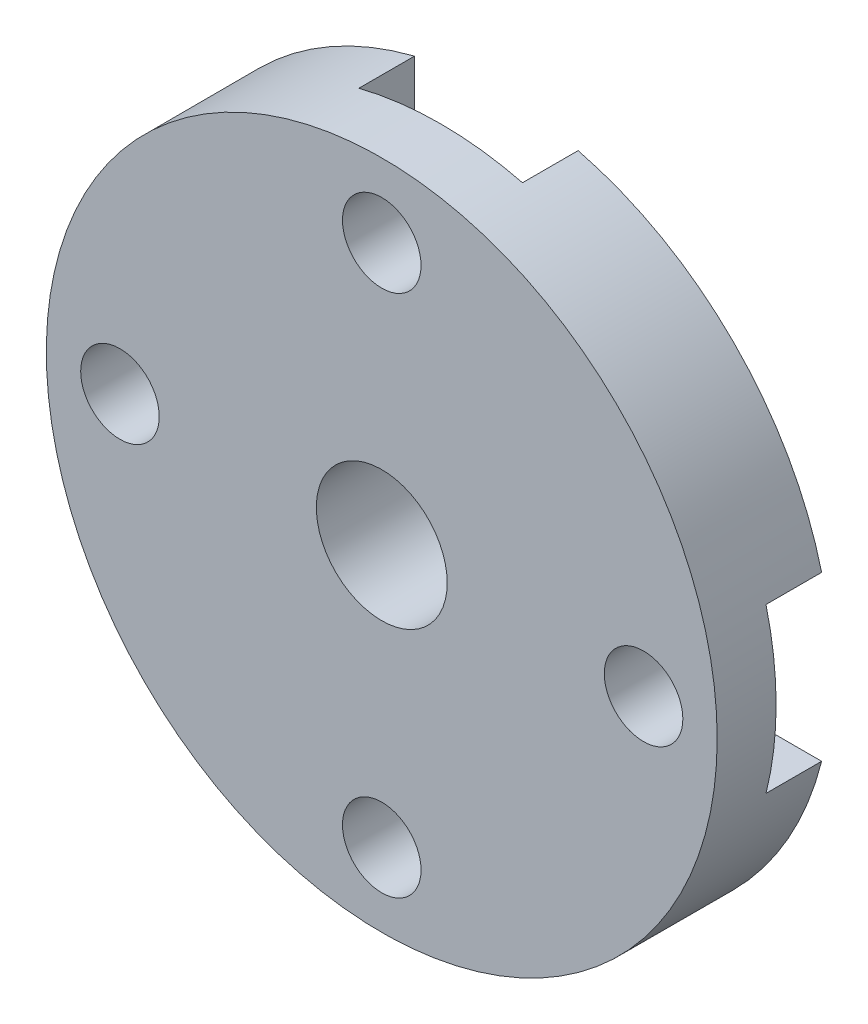
ISO-10303-21;
HEADER;
FILE_DESCRIPTION(('STEP AP214'),'2;1');
FILE_NAME('part.step','',(''),(''),'','','');
FILE_SCHEMA(('AUTOMOTIVE_DESIGN { 1 0 10303 214 1 1 1 1 }'));
ENDSEC;
DATA;
#1=APPLICATION_CONTEXT('core data for automotive mechanical design processes');
#2=APPLICATION_PROTOCOL_DEFINITION('international standard','automotive_design',2000,#1);
#3=PRODUCT_CONTEXT('',#1,'mechanical');
#4=PRODUCT('Part','Part','',(#3));
#5=PRODUCT_RELATED_PRODUCT_CATEGORY('part','',(#4));
#6=PRODUCT_DEFINITION_FORMATION('','',#4);
#7=PRODUCT_DEFINITION_CONTEXT('part definition',#1,'design');
#8=PRODUCT_DEFINITION('design','',#6,#7);
#9=PRODUCT_DEFINITION_SHAPE('','',#8);
#10=(LENGTH_UNIT() NAMED_UNIT(*) SI_UNIT(.MILLI.,.METRE.));
#11=(NAMED_UNIT(*) PLANE_ANGLE_UNIT() SI_UNIT($,.RADIAN.));
#12=(NAMED_UNIT(*) SI_UNIT($,.STERADIAN.) SOLID_ANGLE_UNIT());
#13=UNCERTAINTY_MEASURE_WITH_UNIT(LENGTH_MEASURE(1.E-05),#10,'distance_accuracy_value','');
#14=(GEOMETRIC_REPRESENTATION_CONTEXT(3) GLOBAL_UNCERTAINTY_ASSIGNED_CONTEXT((#13)) GLOBAL_UNIT_ASSIGNED_CONTEXT((#10,
#11,#12)) REPRESENTATION_CONTEXT('',''));
#15=CARTESIAN_POINT('',(0.,0.,0.));
#16=DIRECTION('',(0.,0.,1.));
#17=DIRECTION('',(1.,0.,0.));
#18=AXIS2_PLACEMENT_3D('',#15,#16,#17);
#19=CARTESIAN_POINT('',(0.,8.,3.5));
#20=DIRECTION('',(0.,0.,-1.));
#21=DIRECTION('',(-1.,0.,0.));
#22=AXIS2_PLACEMENT_3D('',#19,#20,#21);
#23=CYLINDRICAL_SURFACE('',#22,1.2);
#24=CARTESIAN_POINT('',(0.,8.,3.5));
#25=DIRECTION('',(0.,0.,1.));
#26=DIRECTION('',(1.,0.,0.));
#27=AXIS2_PLACEMENT_3D('',#24,#25,#26);
#28=CIRCLE('',#27,1.2);
#29=CARTESIAN_POINT('',(1.2,8.,3.5));
#30=VERTEX_POINT('',#29);
#31=EDGE_CURVE('E315',#30,#30,#28,.T.);
#32=ORIENTED_EDGE('',*,*,#31,.T.);
#33=EDGE_LOOP('',(#32));
#34=FACE_BOUND('',#33,.T.);
#35=CARTESIAN_POINT('',(0.,8.,1.7));
#36=DIRECTION('',(0.,0.,-1.));
#37=DIRECTION('',(-1.,0.,0.));
#38=AXIS2_PLACEMENT_3D('',#35,#36,#37);
#39=CIRCLE('',#38,1.2);
#40=CARTESIAN_POINT('',(-1.2,8.,1.7));
#41=VERTEX_POINT('',#40);
#42=EDGE_CURVE('E214',#41,#41,#39,.F.);
#43=ORIENTED_EDGE('',*,*,#42,.F.);
#44=EDGE_LOOP('',(#43));
#45=FACE_BOUND('',#44,.T.);
#46=ADVANCED_FACE('F47',(#34,#45),#23,.F.);
#47=CARTESIAN_POINT('',(8.,0.,3.5));
#48=DIRECTION('',(0.,0.,-1.));
#49=DIRECTION('',(-1.,0.,0.));
#50=AXIS2_PLACEMENT_3D('',#47,#48,#49);
#51=CYLINDRICAL_SURFACE('',#50,1.2);
#52=CARTESIAN_POINT('',(8.,0.,3.5));
#53=DIRECTION('',(0.,0.,1.));
#54=DIRECTION('',(1.,0.,0.));
#55=AXIS2_PLACEMENT_3D('',#52,#53,#54);
#56=CIRCLE('',#55,1.2);
#57=CARTESIAN_POINT('',(9.2,0.,3.5));
#58=VERTEX_POINT('',#57);
#59=EDGE_CURVE('E311',#58,#58,#56,.T.);
#60=ORIENTED_EDGE('',*,*,#59,.T.);
#61=EDGE_LOOP('',(#60));
#62=FACE_BOUND('',#61,.T.);
#63=CARTESIAN_POINT('',(8.,0.,1.7));
#64=DIRECTION('',(0.,0.,-1.));
#65=DIRECTION('',(-1.,0.,0.));
#66=AXIS2_PLACEMENT_3D('',#63,#64,#65);
#67=CIRCLE('',#66,1.2);
#68=CARTESIAN_POINT('',(6.8,0.,1.7));
#69=VERTEX_POINT('',#68);
#70=EDGE_CURVE('E239',#69,#69,#67,.F.);
#71=ORIENTED_EDGE('',*,*,#70,.F.);
#72=EDGE_LOOP('',(#71));
#73=FACE_BOUND('',#72,.T.);
#74=ADVANCED_FACE('F435',(#62,#73),#51,.F.);
#75=CARTESIAN_POINT('',(0.,-8.,3.5));
#76=DIRECTION('',(0.,0.,-1.));
#77=DIRECTION('',(-1.,0.,0.));
#78=AXIS2_PLACEMENT_3D('',#75,#76,#77);
#79=CYLINDRICAL_SURFACE('',#78,1.2);
#80=CARTESIAN_POINT('',(0.,-8.,3.5));
#81=DIRECTION('',(0.,0.,1.));
#82=DIRECTION('',(1.,0.,0.));
#83=AXIS2_PLACEMENT_3D('',#80,#81,#82);
#84=CIRCLE('',#83,1.2);
#85=CARTESIAN_POINT('',(1.19999999999994,-8.,3.5));
#86=VERTEX_POINT('',#85);
#87=EDGE_CURVE('E306',#86,#86,#84,.T.);
#88=ORIENTED_EDGE('',*,*,#87,.T.);
#89=EDGE_LOOP('',(#88));
#90=FACE_BOUND('',#89,.T.);
#91=CARTESIAN_POINT('',(0.,-8.,1.7));
#92=DIRECTION('',(0.,0.,-1.));
#93=DIRECTION('',(-1.,0.,0.));
#94=AXIS2_PLACEMENT_3D('',#91,#92,#93);
#95=CIRCLE('',#94,1.2);
#96=CARTESIAN_POINT('',(-1.20000000000006,-8.,1.7));
#97=VERTEX_POINT('',#96);
#98=EDGE_CURVE('E195',#97,#97,#95,.F.);
#99=ORIENTED_EDGE('',*,*,#98,.F.);
#100=EDGE_LOOP('',(#99));
#101=FACE_BOUND('',#100,.T.);
#102=ADVANCED_FACE('F442',(#90,#101),#79,.F.);
#103=CARTESIAN_POINT('',(-8.,0.,3.5));
#104=DIRECTION('',(0.,0.,-1.));
#105=DIRECTION('',(-1.,0.,0.));
#106=AXIS2_PLACEMENT_3D('',#103,#104,#105);
#107=CYLINDRICAL_SURFACE('',#106,1.2);
#108=CARTESIAN_POINT('',(-8.,0.,3.5));
#109=DIRECTION('',(0.,0.,1.));
#110=DIRECTION('',(1.,0.,0.));
#111=AXIS2_PLACEMENT_3D('',#108,#109,#110);
#112=CIRCLE('',#111,1.2);
#113=CARTESIAN_POINT('',(-6.8,0.,3.5));
#114=VERTEX_POINT('',#113);
#115=EDGE_CURVE('E302',#114,#114,#112,.T.);
#116=ORIENTED_EDGE('',*,*,#115,.T.);
#117=EDGE_LOOP('',(#116));
#118=FACE_BOUND('',#117,.T.);
#119=CARTESIAN_POINT('',(-8.,0.,1.7));
#120=DIRECTION('',(0.,0.,-1.));
#121=DIRECTION('',(-1.,0.,0.));
#122=AXIS2_PLACEMENT_3D('',#119,#120,#121);
#123=CIRCLE('',#122,1.2);
#124=CARTESIAN_POINT('',(-9.2,0.,1.7));
#125=VERTEX_POINT('',#124);
#126=EDGE_CURVE('E167',#125,#125,#123,.F.);
#127=ORIENTED_EDGE('',*,*,#126,.F.);
#128=EDGE_LOOP('',(#127));
#129=FACE_BOUND('',#128,.T.);
#130=ADVANCED_FACE('F49',(#118,#129),#107,.F.);
#131=CARTESIAN_POINT('',(0.,0.,3.5));
#132=DIRECTION('',(0.,0.,-1.));
#133=DIRECTION('',(-1.,0.,0.));
#134=AXIS2_PLACEMENT_3D('',#131,#132,#133);
#135=CYLINDRICAL_SURFACE('',#134,10.25);
#136=CARTESIAN_POINT('',(0.,0.,3.5));
#137=DIRECTION('',(0.,0.,1.));
#138=DIRECTION('',(1.,0.,0.));
#139=AXIS2_PLACEMENT_3D('',#136,#137,#138);
#140=CIRCLE('',#139,10.25);
#141=CARTESIAN_POINT('',(10.25,0.,3.5));
#142=VERTEX_POINT('',#141);
#143=EDGE_CURVE('E323',#142,#142,#140,.T.);
#144=ORIENTED_EDGE('',*,*,#143,.F.);
#145=EDGE_LOOP('',(#144));
#146=FACE_BOUND('',#145,.T.);
#147=DIRECTION('',(0.,0.,-1.));
#148=VECTOR('',#147,1.);
#149=CARTESIAN_POINT('',(-2.50099999999994,-9.94019612482572,1.7));
#150=LINE('',#149,#148);
#151=CARTESIAN_POINT('',(-2.50099999999994,-9.94019612482572,1.7));
#152=VERTEX_POINT('',#151);
#153=CARTESIAN_POINT('',(-2.50099999999994,-9.94019612482572,0.));
#154=VERTEX_POINT('',#153);
#155=EDGE_CURVE('E260',#152,#154,#150,.T.);
#156=ORIENTED_EDGE('',*,*,#155,.F.);
#157=CARTESIAN_POINT('',(0.,0.,1.7));
#158=DIRECTION('',(0.,0.,-1.));
#159=DIRECTION('',(-1.,0.,0.));
#160=AXIS2_PLACEMENT_3D('',#157,#158,#159);
#161=CIRCLE('',#160,10.25);
#162=CARTESIAN_POINT('',(2.49800000000006,-9.94095045757697,1.7));
#163=VERTEX_POINT('',#162);
#164=EDGE_CURVE('E207',#163,#152,#161,.T.);
#165=ORIENTED_EDGE('',*,*,#164,.F.);
#166=DIRECTION('',(0.,0.,-1.));
#167=VECTOR('',#166,1.);
#168=CARTESIAN_POINT('',(2.49800000000006,-9.94095045757697,1.7));
#169=LINE('',#168,#167);
#170=CARTESIAN_POINT('',(2.49800000000006,-9.94095045757697,0.));
#171=VERTEX_POINT('',#170);
#172=EDGE_CURVE('E263',#163,#171,#169,.T.);
#173=ORIENTED_EDGE('',*,*,#172,.T.);
#174=CARTESIAN_POINT('',(0.,0.,0.));
#175=DIRECTION('',(0.,0.,1.));
#176=DIRECTION('',(1.,0.,0.));
#177=AXIS2_PLACEMENT_3D('',#174,#175,#176);
#178=CIRCLE('',#177,10.25);
#179=CARTESIAN_POINT('',(9.94069912028324,-2.49900000000003,0.));
#180=VERTEX_POINT('',#179);
#181=EDGE_CURVE('E331',#171,#180,#178,.T.);
#182=ORIENTED_EDGE('',*,*,#181,.T.);
#183=DIRECTION('',(0.,0.,-1.));
#184=VECTOR('',#183,1.);
#185=CARTESIAN_POINT('',(9.94069912028324,-2.49900000000003,1.7));
#186=LINE('',#185,#184);
#187=CARTESIAN_POINT('',(9.94069912028324,-2.49900000000003,1.7));
#188=VERTEX_POINT('',#187);
#189=EDGE_CURVE('E298',#188,#180,#186,.T.);
#190=ORIENTED_EDGE('',*,*,#189,.F.);
#191=CARTESIAN_POINT('',(0.,0.,1.7));
#192=DIRECTION('',(0.,0.,-1.));
#193=DIRECTION('',(-1.,0.,0.));
#194=AXIS2_PLACEMENT_3D('',#191,#192,#193);
#195=CIRCLE('',#194,10.25);
#196=CARTESIAN_POINT('',(9.94069932139572,2.49899920000038,1.7));
#197=VERTEX_POINT('',#196);
#198=EDGE_CURVE('E283',#197,#188,#195,.T.);
#199=ORIENTED_EDGE('',*,*,#198,.F.);
#200=DIRECTION('',(0.,0.,-1.));
#201=VECTOR('',#200,1.);
#202=CARTESIAN_POINT('',(9.94069932139572,2.49899920000038,1.7));
#203=LINE('',#202,#201);
#204=CARTESIAN_POINT('',(9.94069932139573,2.49899920000038,0.));
#205=VERTEX_POINT('',#204);
#206=EDGE_CURVE('E294',#197,#205,#203,.T.);
#207=ORIENTED_EDGE('',*,*,#206,.T.);
#208=CARTESIAN_POINT('',(2.5,9.94044767603552,0.));
#209=VERTEX_POINT('',#208);
#210=EDGE_CURVE('E307',#205,#209,#178,.T.);
#211=ORIENTED_EDGE('',*,*,#210,.T.);
#212=DIRECTION('',(0.,0.,-1.));
#213=VECTOR('',#212,1.);
#214=CARTESIAN_POINT('',(2.5,9.94044767603552,1.7));
#215=LINE('',#214,#213);
#216=CARTESIAN_POINT('',(2.5,9.94044767603552,1.7));
#217=VERTEX_POINT('',#216);
#218=EDGE_CURVE('E240',#217,#209,#215,.T.);
#219=ORIENTED_EDGE('',*,*,#218,.F.);
#220=CARTESIAN_POINT('',(0.,0.,1.7));
#221=DIRECTION('',(0.,0.,-1.));
#222=DIRECTION('',(-1.,0.,0.));
#223=AXIS2_PLACEMENT_3D('',#220,#221,#222);
#224=CIRCLE('',#223,10.25);
#225=CARTESIAN_POINT('',(-2.5,9.94044767603552,1.7));
#226=VERTEX_POINT('',#225);
#227=EDGE_CURVE('E227',#226,#217,#224,.T.);
#228=ORIENTED_EDGE('',*,*,#227,.F.);
#229=DIRECTION('',(0.,0.,-1.));
#230=VECTOR('',#229,1.);
#231=CARTESIAN_POINT('',(-2.5,9.94044767603552,1.7));
#232=LINE('',#231,#230);
#233=CARTESIAN_POINT('',(-2.5,9.94044767603552,0.));
#234=VERTEX_POINT('',#233);
#235=EDGE_CURVE('E243',#226,#234,#232,.T.);
#236=ORIENTED_EDGE('',*,*,#235,.T.);
#237=CARTESIAN_POINT('',(-9.94019612482571,2.50099999999997,0.));
#238=VERTEX_POINT('',#237);
#239=EDGE_CURVE('E335',#234,#238,#178,.T.);
#240=ORIENTED_EDGE('',*,*,#239,.T.);
#241=DIRECTION('',(0.,0.,-1.));
#242=VECTOR('',#241,1.);
#243=CARTESIAN_POINT('',(-9.94019612482571,2.50099999999997,1.7));
#244=LINE('',#243,#242);
#245=CARTESIAN_POINT('',(-9.94019612482571,2.50099999999997,1.7));
#246=VERTEX_POINT('',#245);
#247=EDGE_CURVE('E219',#246,#238,#244,.T.);
#248=ORIENTED_EDGE('',*,*,#247,.F.);
#249=CARTESIAN_POINT('',(0.,0.,1.7));
#250=DIRECTION('',(0.,0.,-1.));
#251=DIRECTION('',(-1.,0.,0.));
#252=AXIS2_PLACEMENT_3D('',#249,#250,#251);
#253=CIRCLE('',#252,10.25);
#254=CARTESIAN_POINT('',(-9.94069912028324,-2.49900000000003,1.7));
#255=VERTEX_POINT('',#254);
#256=EDGE_CURVE('E176',#255,#246,#253,.T.);
#257=ORIENTED_EDGE('',*,*,#256,.F.);
#258=DIRECTION('',(0.,0.,-1.));
#259=VECTOR('',#258,1.);
#260=CARTESIAN_POINT('',(-9.94069912028324,-2.49900000000003,1.7));
#261=LINE('',#260,#259);
#262=CARTESIAN_POINT('',(-9.94069912028324,-2.49900000000003,0.));
#263=VERTEX_POINT('',#262);
#264=EDGE_CURVE('E249',#255,#263,#261,.T.);
#265=ORIENTED_EDGE('',*,*,#264,.T.);
#266=EDGE_CURVE('E336',#263,#154,#178,.T.);
#267=ORIENTED_EDGE('',*,*,#266,.T.);
#268=EDGE_LOOP('',(#156,#165,#173,#182,#190,#199,#207,#211,#219,#228,#236,#240,#248,#257,#265,#267));
#269=FACE_BOUND('',#268,.T.);
#270=ADVANCED_FACE('F390',(#146,#269),#135,.T.);
#271=CARTESIAN_POINT('',(0.,0.,0.));
#272=DIRECTION('',(0.,0.,1.));
#273=DIRECTION('',(1.,0.,0.));
#274=AXIS2_PLACEMENT_3D('',#271,#272,#273);
#275=PLANE('',#274);
#276=CARTESIAN_POINT('',(0.,0.,0.));
#277=DIRECTION('',(0.,0.,1.));
#278=DIRECTION('',(1.,0.,0.));
#279=AXIS2_PLACEMENT_3D('',#276,#277,#278);
#280=CIRCLE('',#279,2.);
#281=CARTESIAN_POINT('',(2.,0.,0.));
#282=VERTEX_POINT('',#281);
#283=EDGE_CURVE('E301',#282,#282,#280,.T.);
#284=ORIENTED_EDGE('',*,*,#283,.T.);
#285=EDGE_LOOP('',(#284));
#286=FACE_BOUND('',#285,.T.);
#287=DIRECTION('',(0.,1.,0.));
#288=VECTOR('',#287,1.);
#289=CARTESIAN_POINT('',(-2.50099999999994,0.,0.));
#290=LINE('',#289,#288);
#291=CARTESIAN_POINT('',(-2.50100020015988,-8.07068945608362,0.));
#292=VERTEX_POINT('',#291);
#293=EDGE_CURVE('E11',#154,#292,#290,.T.);
#294=ORIENTED_EDGE('',*,*,#293,.F.);
#295=ORIENTED_EDGE('',*,*,#266,.F.);
#296=DIRECTION('',(1.,0.,0.));
#297=VECTOR('',#296,1.);
#298=CARTESIAN_POINT('',(0.,-2.49900000000003,0.));
#299=LINE('',#298,#297);
#300=CARTESIAN_POINT('',(-8.001,-2.49900000000003,0.));
#301=VERTEX_POINT('',#300);
#302=EDGE_CURVE('E362',#263,#301,#299,.T.);
#303=ORIENTED_EDGE('',*,*,#302,.T.);
#304=CARTESIAN_POINT('',(-8.001,0.000999999999972068,0.));
#305=DIRECTION('',(0.,0.,-1.));
#306=DIRECTION('',(-1.,0.,0.));
#307=AXIS2_PLACEMENT_3D('',#304,#305,#306);
#308=CIRCLE('',#307,2.5);
#309=CARTESIAN_POINT('',(-8.001,2.50099999999997,0.));
#310=VERTEX_POINT('',#309);
#311=EDGE_CURVE('E356',#301,#310,#308,.F.);
#312=ORIENTED_EDGE('',*,*,#311,.T.);
#313=DIRECTION('',(1.,0.,0.));
#314=VECTOR('',#313,1.);
#315=CARTESIAN_POINT('',(0.,2.50099999999997,0.));
#316=LINE('',#315,#314);
#317=EDGE_CURVE('E161',#238,#310,#316,.T.);
#318=ORIENTED_EDGE('',*,*,#317,.F.);
#319=ORIENTED_EDGE('',*,*,#239,.F.);
#320=DIRECTION('',(0.,1.,0.));
#321=VECTOR('',#320,1.);
#322=CARTESIAN_POINT('',(-2.5,0.,0.));
#323=LINE('',#322,#321);
#324=CARTESIAN_POINT('',(-2.5,8.,0.));
#325=VERTEX_POINT('',#324);
#326=EDGE_CURVE('E348',#234,#325,#323,.F.);
#327=ORIENTED_EDGE('',*,*,#326,.T.);
#328=CARTESIAN_POINT('',(0.,8.,0.));
#329=DIRECTION('',(0.,0.,-1.));
#330=DIRECTION('',(-1.,0.,0.));
#331=AXIS2_PLACEMENT_3D('',#328,#329,#330);
#332=CIRCLE('',#331,2.5);
#333=CARTESIAN_POINT('',(2.5,8.,0.));
#334=VERTEX_POINT('',#333);
#335=EDGE_CURVE('E352',#325,#334,#332,.F.);
#336=ORIENTED_EDGE('',*,*,#335,.T.);
#337=DIRECTION('',(0.,1.,0.));
#338=VECTOR('',#337,1.);
#339=CARTESIAN_POINT('',(2.5,0.,0.));
#340=LINE('',#339,#338);
#341=EDGE_CURVE('E353',#209,#334,#340,.F.);
#342=ORIENTED_EDGE('',*,*,#341,.F.);
#343=ORIENTED_EDGE('',*,*,#210,.F.);
#344=DIRECTION('',(1.,0.,0.));
#345=VECTOR('',#344,1.);
#346=CARTESIAN_POINT('',(0.,2.49899920000038,0.));
#347=LINE('',#346,#345);
#348=CARTESIAN_POINT('',(8.00099999935998,2.49899920000043,0.));
#349=VERTEX_POINT('',#348);
#350=EDGE_CURVE('E340',#205,#349,#347,.F.);
#351=ORIENTED_EDGE('',*,*,#350,.T.);
#352=CARTESIAN_POINT('',(7.999,-0.000999999999916204,0.));
#353=DIRECTION('',(0.,0.,-1.));
#354=DIRECTION('',(-1.,0.,0.));
#355=AXIS2_PLACEMENT_3D('',#352,#353,#354);
#356=CIRCLE('',#355,2.5);
#357=CARTESIAN_POINT('',(8.09897999799685,-2.49900000000003,0.));
#358=VERTEX_POINT('',#357);
#359=EDGE_CURVE('E327',#349,#358,#356,.F.);
#360=ORIENTED_EDGE('',*,*,#359,.T.);
#361=DIRECTION('',(1.,0.,0.));
#362=VECTOR('',#361,1.);
#363=CARTESIAN_POINT('',(0.,-2.49900000000003,0.));
#364=LINE('',#363,#362);
#365=EDGE_CURVE('E344',#180,#358,#364,.F.);
#366=ORIENTED_EDGE('',*,*,#365,.F.);
#367=ORIENTED_EDGE('',*,*,#181,.F.);
#368=DIRECTION('',(0.,1.,0.));
#369=VECTOR('',#368,1.);
#370=CARTESIAN_POINT('',(2.49800000000006,0.,0.));
#371=LINE('',#370,#369);
#372=CARTESIAN_POINT('',(2.49800000000006,-8.,0.));
#373=VERTEX_POINT('',#372);
#374=EDGE_CURVE('E368',#171,#373,#371,.T.);
#375=ORIENTED_EDGE('',*,*,#374,.T.);
#376=CARTESIAN_POINT('',(-0.00199999999994414,-8.,0.));
#377=DIRECTION('',(0.,0.,-1.));
#378=DIRECTION('',(-1.,0.,0.));
#379=AXIS2_PLACEMENT_3D('',#376,#377,#378);
#380=CIRCLE('',#379,2.50000000000003);
#381=EDGE_CURVE('E51',#373,#292,#380,.F.);
#382=ORIENTED_EDGE('',*,*,#381,.T.);
#383=EDGE_LOOP('',(#294,#295,#303,#312,#318,#319,#327,#336,#342,#343,#351,#360,#366,#367,#375,#382));
#384=FACE_BOUND('',#383,.T.);
#385=ADVANCED_FACE('F376',(#286,#384),#275,.F.);
#386=CARTESIAN_POINT('',(0.,0.,3.5));
#387=DIRECTION('',(0.,0.,-1.));
#388=DIRECTION('',(-1.,0.,0.));
#389=AXIS2_PLACEMENT_3D('',#386,#387,#388);
#390=CYLINDRICAL_SURFACE('',#389,2.);
#391=CARTESIAN_POINT('',(0.,0.,3.5));
#392=DIRECTION('',(0.,0.,1.));
#393=DIRECTION('',(1.,0.,0.));
#394=AXIS2_PLACEMENT_3D('',#391,#392,#393);
#395=CIRCLE('',#394,2.);
#396=CARTESIAN_POINT('',(2.,0.,3.5));
#397=VERTEX_POINT('',#396);
#398=EDGE_CURVE('E319',#397,#397,#395,.T.);
#399=ORIENTED_EDGE('',*,*,#398,.T.);
#400=EDGE_LOOP('',(#399));
#401=FACE_BOUND('',#400,.T.);
#402=ORIENTED_EDGE('',*,*,#283,.F.);
#403=EDGE_LOOP('',(#402));
#404=FACE_BOUND('',#403,.T.);
#405=ADVANCED_FACE('F447',(#401,#404),#390,.F.);
#406=CARTESIAN_POINT('',(0.,0.,3.5));
#407=DIRECTION('',(0.,0.,1.));
#408=DIRECTION('',(1.,0.,0.));
#409=AXIS2_PLACEMENT_3D('',#406,#407,#408);
#410=PLANE('',#409);
#411=ORIENTED_EDGE('',*,*,#115,.F.);
#412=EDGE_LOOP('',(#411));
#413=FACE_BOUND('',#412,.T.);
#414=ORIENTED_EDGE('',*,*,#87,.F.);
#415=EDGE_LOOP('',(#414));
#416=FACE_BOUND('',#415,.T.);
#417=ORIENTED_EDGE('',*,*,#59,.F.);
#418=EDGE_LOOP('',(#417));
#419=FACE_BOUND('',#418,.T.);
#420=ORIENTED_EDGE('',*,*,#31,.F.);
#421=EDGE_LOOP('',(#420));
#422=FACE_BOUND('',#421,.T.);
#423=ORIENTED_EDGE('',*,*,#398,.F.);
#424=EDGE_LOOP('',(#423));
#425=FACE_BOUND('',#424,.T.);
#426=ORIENTED_EDGE('',*,*,#143,.T.);
#427=EDGE_LOOP('',(#426));
#428=FACE_BOUND('',#427,.T.);
#429=ADVANCED_FACE('F493',(#413,#416,#419,#422,#425,#428),#410,.T.);
#430=CARTESIAN_POINT('',(0.,-2.49900000000003,1.7));
#431=DIRECTION('',(0.,1.,0.));
#432=DIRECTION('',(0.,0.,1.));
#433=AXIS2_PLACEMENT_3D('',#430,#431,#432);
#434=PLANE('',#433);
#435=ORIENTED_EDGE('',*,*,#365,.T.);
#436=DIRECTION('',(0.,0.,-1.));
#437=VECTOR('',#436,1.);
#438=CARTESIAN_POINT('',(8.09897999799685,-2.49900000000003,1.7));
#439=LINE('',#438,#437);
#440=CARTESIAN_POINT('',(8.09897999799685,-2.49900000000003,1.7));
#441=VERTEX_POINT('',#440);
#442=EDGE_CURVE('E287',#441,#358,#439,.T.);
#443=ORIENTED_EDGE('',*,*,#442,.F.);
#444=DIRECTION('',(1.,0.,0.));
#445=VECTOR('',#444,1.);
#446=CARTESIAN_POINT('',(0.,-2.49900000000003,1.7));
#447=LINE('',#446,#445);
#448=EDGE_CURVE('E272',#441,#188,#447,.T.);
#449=ORIENTED_EDGE('',*,*,#448,.T.);
#450=ORIENTED_EDGE('',*,*,#189,.T.);
#451=EDGE_LOOP('',(#435,#443,#449,#450));
#452=FACE_BOUND('',#451,.T.);
#453=ADVANCED_FACE('F400',(#452),#434,.T.);
#454=CARTESIAN_POINT('',(0.,2.49899920000039,1.7));
#455=DIRECTION('',(0.,1.,0.));
#456=DIRECTION('',(-1.,0.,0.));
#457=AXIS2_PLACEMENT_3D('',#454,#455,#456);
#458=PLANE('',#457);
#459=ORIENTED_EDGE('',*,*,#206,.F.);
#460=DIRECTION('',(1.,0.,0.));
#461=VECTOR('',#460,1.);
#462=CARTESIAN_POINT('',(0.,2.49899920000039,1.7));
#463=LINE('',#462,#461);
#464=CARTESIAN_POINT('',(8.00099999935998,2.49899920000038,1.7));
#465=VERTEX_POINT('',#464);
#466=EDGE_CURVE('E279',#465,#197,#463,.T.);
#467=ORIENTED_EDGE('',*,*,#466,.F.);
#468=DIRECTION('',(0.,0.,-1.));
#469=VECTOR('',#468,1.);
#470=CARTESIAN_POINT('',(8.00099999935998,2.49899920000038,1.7));
#471=LINE('',#470,#469);
#472=EDGE_CURVE('E290',#465,#349,#471,.T.);
#473=ORIENTED_EDGE('',*,*,#472,.T.);
#474=ORIENTED_EDGE('',*,*,#350,.F.);
#475=EDGE_LOOP('',(#459,#467,#473,#474));
#476=FACE_BOUND('',#475,.T.);
#477=ADVANCED_FACE('F485',(#476),#458,.F.);
#478=CARTESIAN_POINT('',(7.999,-0.000999999999916204,1.7));
#479=DIRECTION('',(0.,0.,-1.));
#480=DIRECTION('',(-1.,0.,0.));
#481=AXIS2_PLACEMENT_3D('',#478,#479,#480);
#482=CYLINDRICAL_SURFACE('',#481,2.5);
#483=ORIENTED_EDGE('',*,*,#472,.F.);
#484=CARTESIAN_POINT('',(7.999,-0.000999999999916204,1.7));
#485=DIRECTION('',(0.,0.,-1.));
#486=DIRECTION('',(-1.,0.,0.));
#487=AXIS2_PLACEMENT_3D('',#484,#485,#486);
#488=CIRCLE('',#487,2.5);
#489=EDGE_CURVE('E275',#441,#465,#488,.T.);
#490=ORIENTED_EDGE('',*,*,#489,.F.);
#491=ORIENTED_EDGE('',*,*,#442,.T.);
#492=ORIENTED_EDGE('',*,*,#359,.F.);
#493=EDGE_LOOP('',(#483,#490,#491,#492));
#494=FACE_BOUND('',#493,.T.);
#495=ADVANCED_FACE('F483',(#494),#482,.F.);
#496=CARTESIAN_POINT('',(0.,0.,1.7));
#497=DIRECTION('',(0.,0.,-1.));
#498=DIRECTION('',(-1.,0.,0.));
#499=AXIS2_PLACEMENT_3D('',#496,#497,#498);
#500=PLANE('',#499);
#501=ORIENTED_EDGE('',*,*,#70,.T.);
#502=EDGE_LOOP('',(#501));
#503=FACE_BOUND('',#502,.T.);
#504=ORIENTED_EDGE('',*,*,#448,.F.);
#505=ORIENTED_EDGE('',*,*,#489,.T.);
#506=ORIENTED_EDGE('',*,*,#466,.T.);
#507=ORIENTED_EDGE('',*,*,#198,.T.);
#508=EDGE_LOOP('',(#504,#505,#506,#507));
#509=FACE_BOUND('',#508,.T.);
#510=ADVANCED_FACE('F404',(#503,#509),#500,.T.);
#511=CARTESIAN_POINT('',(0.,8.,1.7));
#512=DIRECTION('',(0.,0.,-1.));
#513=DIRECTION('',(-1.,0.,0.));
#514=AXIS2_PLACEMENT_3D('',#511,#512,#513);
#515=CYLINDRICAL_SURFACE('',#514,2.5);
#516=DIRECTION('',(0.,0.,-1.));
#517=VECTOR('',#516,1.);
#518=CARTESIAN_POINT('',(-2.5,8.,1.7));
#519=LINE('',#518,#517);
#520=CARTESIAN_POINT('',(-2.5,8.,1.7));
#521=VERTEX_POINT('',#520);
#522=EDGE_CURVE('E234',#521,#325,#519,.T.);
#523=ORIENTED_EDGE('',*,*,#522,.F.);
#524=CARTESIAN_POINT('',(0.,8.,1.7));
#525=DIRECTION('',(0.,0.,-1.));
#526=DIRECTION('',(-1.,0.,0.));
#527=AXIS2_PLACEMENT_3D('',#524,#525,#526);
#528=CIRCLE('',#527,2.5);
#529=CARTESIAN_POINT('',(2.5,8.,1.7));
#530=VERTEX_POINT('',#529);
#531=EDGE_CURVE('E218',#530,#521,#528,.T.);
#532=ORIENTED_EDGE('',*,*,#531,.F.);
#533=DIRECTION('',(0.,0.,-1.));
#534=VECTOR('',#533,1.);
#535=CARTESIAN_POINT('',(2.5,8.,1.7));
#536=LINE('',#535,#534);
#537=EDGE_CURVE('E235',#530,#334,#536,.T.);
#538=ORIENTED_EDGE('',*,*,#537,.T.);
#539=ORIENTED_EDGE('',*,*,#335,.F.);
#540=EDGE_LOOP('',(#523,#532,#538,#539));
#541=FACE_BOUND('',#540,.T.);
#542=ADVANCED_FACE('F416',(#541),#515,.F.);
#543=CARTESIAN_POINT('',(2.5,0.,1.7));
#544=DIRECTION('',(-1.,0.,0.));
#545=DIRECTION('',(0.,0.,1.));
#546=AXIS2_PLACEMENT_3D('',#543,#544,#545);
#547=PLANE('',#546);
#548=ORIENTED_EDGE('',*,*,#341,.T.);
#549=ORIENTED_EDGE('',*,*,#537,.F.);
#550=DIRECTION('',(0.,1.,0.));
#551=VECTOR('',#550,1.);
#552=CARTESIAN_POINT('',(2.5,0.,1.7));
#553=LINE('',#552,#551);
#554=EDGE_CURVE('E231',#530,#217,#553,.T.);
#555=ORIENTED_EDGE('',*,*,#554,.T.);
#556=ORIENTED_EDGE('',*,*,#218,.T.);
#557=EDGE_LOOP('',(#548,#549,#555,#556));
#558=FACE_BOUND('',#557,.T.);
#559=ADVANCED_FACE('F412',(#558),#547,.T.);
#560=CARTESIAN_POINT('',(-2.5,0.,1.7));
#561=DIRECTION('',(-1.,0.,0.));
#562=DIRECTION('',(0.,0.,1.));
#563=AXIS2_PLACEMENT_3D('',#560,#561,#562);
#564=PLANE('',#563);
#565=ORIENTED_EDGE('',*,*,#235,.F.);
#566=DIRECTION('',(0.,1.,0.));
#567=VECTOR('',#566,1.);
#568=CARTESIAN_POINT('',(-2.5,0.,1.7));
#569=LINE('',#568,#567);
#570=EDGE_CURVE('E223',#521,#226,#569,.T.);
#571=ORIENTED_EDGE('',*,*,#570,.F.);
#572=ORIENTED_EDGE('',*,*,#522,.T.);
#573=ORIENTED_EDGE('',*,*,#326,.F.);
#574=EDGE_LOOP('',(#565,#571,#572,#573));
#575=FACE_BOUND('',#574,.T.);
#576=ADVANCED_FACE('F473',(#575),#564,.F.);
#577=CARTESIAN_POINT('',(0.,0.,1.7));
#578=DIRECTION('',(0.,0.,-1.));
#579=DIRECTION('',(-1.,0.,0.));
#580=AXIS2_PLACEMENT_3D('',#577,#578,#579);
#581=PLANE('',#580);
#582=ORIENTED_EDGE('',*,*,#42,.T.);
#583=EDGE_LOOP('',(#582));
#584=FACE_BOUND('',#583,.T.);
#585=ORIENTED_EDGE('',*,*,#531,.T.);
#586=ORIENTED_EDGE('',*,*,#570,.T.);
#587=ORIENTED_EDGE('',*,*,#227,.T.);
#588=ORIENTED_EDGE('',*,*,#554,.F.);
#589=EDGE_LOOP('',(#585,#586,#587,#588));
#590=FACE_BOUND('',#589,.T.);
#591=ADVANCED_FACE('F419',(#584,#590),#581,.T.);
#592=CARTESIAN_POINT('',(0.,2.50099999999997,1.7));
#593=DIRECTION('',(0.,-1.,0.));
#594=DIRECTION('',(0.,0.,-1.));
#595=AXIS2_PLACEMENT_3D('',#592,#593,#594);
#596=PLANE('',#595);
#597=ORIENTED_EDGE('',*,*,#317,.T.);
#598=DIRECTION('',(0.,0.,-1.));
#599=VECTOR('',#598,1.);
#600=CARTESIAN_POINT('',(-8.001,2.50099999999997,1.7));
#601=LINE('',#600,#599);
#602=CARTESIAN_POINT('',(-8.001,2.50099999999997,1.7));
#603=VERTEX_POINT('',#602);
#604=EDGE_CURVE('E155',#603,#310,#601,.T.);
#605=ORIENTED_EDGE('',*,*,#604,.F.);
#606=DIRECTION('',(-1.,0.,0.));
#607=VECTOR('',#606,1.);
#608=CARTESIAN_POINT('',(0.,2.50099999999997,1.7));
#609=LINE('',#608,#607);
#610=EDGE_CURVE('E158',#603,#246,#609,.T.);
#611=ORIENTED_EDGE('',*,*,#610,.T.);
#612=ORIENTED_EDGE('',*,*,#247,.T.);
#613=EDGE_LOOP('',(#597,#605,#611,#612));
#614=FACE_BOUND('',#613,.T.);
#615=ADVANCED_FACE('F157',(#614),#596,.T.);
#616=CARTESIAN_POINT('',(0.,-2.49900000000003,1.7));
#617=DIRECTION('',(0.,-1.,0.));
#618=DIRECTION('',(0.,0.,-1.));
#619=AXIS2_PLACEMENT_3D('',#616,#617,#618);
#620=PLANE('',#619);
#621=ORIENTED_EDGE('',*,*,#264,.F.);
#622=DIRECTION('',(-1.,0.,0.));
#623=VECTOR('',#622,1.);
#624=CARTESIAN_POINT('',(0.,-2.49900000000003,1.7));
#625=LINE('',#624,#623);
#626=CARTESIAN_POINT('',(-8.001,-2.49900000000003,1.7));
#627=VERTEX_POINT('',#626);
#628=EDGE_CURVE('E185',#627,#255,#625,.T.);
#629=ORIENTED_EDGE('',*,*,#628,.F.);
#630=DIRECTION('',(0.,0.,-1.));
#631=VECTOR('',#630,1.);
#632=CARTESIAN_POINT('',(-8.001,-2.49900000000003,1.7));
#633=LINE('',#632,#631);
#634=EDGE_CURVE('E166',#627,#301,#633,.T.);
#635=ORIENTED_EDGE('',*,*,#634,.T.);
#636=ORIENTED_EDGE('',*,*,#302,.F.);
#637=EDGE_LOOP('',(#621,#629,#635,#636));
#638=FACE_BOUND('',#637,.T.);
#639=ADVANCED_FACE('F424',(#638),#620,.F.);
#640=CARTESIAN_POINT('',(-8.001,0.000999999999972068,1.7));
#641=DIRECTION('',(0.,0.,-1.));
#642=DIRECTION('',(-1.,0.,0.));
#643=AXIS2_PLACEMENT_3D('',#640,#641,#642);
#644=CYLINDRICAL_SURFACE('',#643,2.5);
#645=ORIENTED_EDGE('',*,*,#634,.F.);
#646=CARTESIAN_POINT('',(-8.001,0.000999999999972068,1.7));
#647=DIRECTION('',(0.,0.,-1.));
#648=DIRECTION('',(-1.,0.,0.));
#649=AXIS2_PLACEMENT_3D('',#646,#647,#648);
#650=CIRCLE('',#649,2.5);
#651=EDGE_CURVE('E174',#603,#627,#650,.T.);
#652=ORIENTED_EDGE('',*,*,#651,.F.);
#653=ORIENTED_EDGE('',*,*,#604,.T.);
#654=ORIENTED_EDGE('',*,*,#311,.F.);
#655=EDGE_LOOP('',(#645,#652,#653,#654));
#656=FACE_BOUND('',#655,.T.);
#657=ADVANCED_FACE('F181',(#656),#644,.F.);
#658=CARTESIAN_POINT('',(0.,0.,1.7));
#659=DIRECTION('',(0.,0.,-1.));
#660=DIRECTION('',(-1.,0.,0.));
#661=AXIS2_PLACEMENT_3D('',#658,#659,#660);
#662=PLANE('',#661);
#663=ORIENTED_EDGE('',*,*,#610,.F.);
#664=ORIENTED_EDGE('',*,*,#651,.T.);
#665=ORIENTED_EDGE('',*,*,#628,.T.);
#666=ORIENTED_EDGE('',*,*,#256,.T.);
#667=EDGE_LOOP('',(#663,#664,#665,#666));
#668=FACE_BOUND('',#667,.T.);
#669=ORIENTED_EDGE('',*,*,#126,.T.);
#670=EDGE_LOOP('',(#669));
#671=FACE_BOUND('',#670,.T.);
#672=ADVANCED_FACE('F171',(#668,#671),#662,.T.);
#673=CARTESIAN_POINT('',(-0.00199999999994414,-8.,1.7));
#674=DIRECTION('',(0.,0.,-1.));
#675=DIRECTION('',(-1.,0.,0.));
#676=AXIS2_PLACEMENT_3D('',#673,#674,#675);
#677=CYLINDRICAL_SURFACE('',#676,2.50000000000003);
#678=DIRECTION('',(0.,0.,-1.));
#679=VECTOR('',#678,1.);
#680=CARTESIAN_POINT('',(2.49800000000006,-8.,1.7));
#681=LINE('',#680,#679);
#682=CARTESIAN_POINT('',(2.49800000000006,-8.,1.7));
#683=VERTEX_POINT('',#682);
#684=EDGE_CURVE('E64',#683,#373,#681,.T.);
#685=ORIENTED_EDGE('',*,*,#684,.F.);
#686=CARTESIAN_POINT('',(-0.00199999999994414,-8.,1.7));
#687=DIRECTION('',(0.,0.,-1.));
#688=DIRECTION('',(-1.,0.,0.));
#689=AXIS2_PLACEMENT_3D('',#686,#687,#688);
#690=CIRCLE('',#689,2.50000000000003);
#691=CARTESIAN_POINT('',(-2.50100040031982,-8.07068945608362,1.7));
#692=VERTEX_POINT('',#691);
#693=EDGE_CURVE('E199',#692,#683,#690,.T.);
#694=ORIENTED_EDGE('',*,*,#693,.F.);
#695=DIRECTION('',(0.,0.,-1.));
#696=VECTOR('',#695,1.);
#697=CARTESIAN_POINT('',(-2.50100040031982,-8.07068945608362,1.7));
#698=LINE('',#697,#696);
#699=EDGE_CURVE('E179',#692,#292,#698,.T.);
#700=ORIENTED_EDGE('',*,*,#699,.T.);
#701=ORIENTED_EDGE('',*,*,#381,.F.);
#702=EDGE_LOOP('',(#685,#694,#700,#701));
#703=FACE_BOUND('',#702,.T.);
#704=ADVANCED_FACE('F380',(#703),#677,.F.);
#705=CARTESIAN_POINT('',(-2.50099999999994,0.,1.7));
#706=DIRECTION('',(1.,0.,0.));
#707=DIRECTION('',(0.,0.,-1.));
#708=AXIS2_PLACEMENT_3D('',#705,#706,#707);
#709=PLANE('',#708);
#710=ORIENTED_EDGE('',*,*,#293,.T.);
#711=ORIENTED_EDGE('',*,*,#699,.F.);
#712=DIRECTION('',(0.,-1.,0.));
#713=VECTOR('',#712,1.);
#714=CARTESIAN_POINT('',(-2.50099999999994,0.,1.7));
#715=LINE('',#714,#713);
#716=EDGE_CURVE('E211',#692,#152,#715,.T.);
#717=ORIENTED_EDGE('',*,*,#716,.T.);
#718=ORIENTED_EDGE('',*,*,#155,.T.);
#719=EDGE_LOOP('',(#710,#711,#717,#718));
#720=FACE_BOUND('',#719,.T.);
#721=ADVANCED_FACE('F384',(#720),#709,.T.);
#722=CARTESIAN_POINT('',(2.49800000000006,0.,1.7));
#723=DIRECTION('',(1.,0.,0.));
#724=DIRECTION('',(0.,0.,-1.));
#725=AXIS2_PLACEMENT_3D('',#722,#723,#724);
#726=PLANE('',#725);
#727=ORIENTED_EDGE('',*,*,#172,.F.);
#728=DIRECTION('',(0.,-1.,0.));
#729=VECTOR('',#728,1.);
#730=CARTESIAN_POINT('',(2.49800000000006,0.,1.7));
#731=LINE('',#730,#729);
#732=EDGE_CURVE('E203',#683,#163,#731,.T.);
#733=ORIENTED_EDGE('',*,*,#732,.F.);
#734=ORIENTED_EDGE('',*,*,#684,.T.);
#735=ORIENTED_EDGE('',*,*,#374,.F.);
#736=EDGE_LOOP('',(#727,#733,#734,#735));
#737=FACE_BOUND('',#736,.T.);
#738=ADVANCED_FACE('F460',(#737),#726,.F.);
#739=CARTESIAN_POINT('',(0.,0.,1.7));
#740=DIRECTION('',(0.,0.,-1.));
#741=DIRECTION('',(-1.,0.,0.));
#742=AXIS2_PLACEMENT_3D('',#739,#740,#741);
#743=PLANE('',#742);
#744=ORIENTED_EDGE('',*,*,#98,.T.);
#745=EDGE_LOOP('',(#744));
#746=FACE_BOUND('',#745,.T.);
#747=ORIENTED_EDGE('',*,*,#693,.T.);
#748=ORIENTED_EDGE('',*,*,#732,.T.);
#749=ORIENTED_EDGE('',*,*,#164,.T.);
#750=ORIENTED_EDGE('',*,*,#716,.F.);
#751=EDGE_LOOP('',(#747,#748,#749,#750));
#752=FACE_BOUND('',#751,.T.);
#753=ADVANCED_FACE('F386',(#746,#752),#743,.T.);
#754=CLOSED_SHELL('',(#46,#74,#102,#130,#270,#385,#405,#429,#453,#477,#495,#510,#542,#559,#576,
#591,#615,#639,#657,#672,#704,#721,#738,#753));
#755=MANIFOLD_SOLID_BREP('B2',#754);
#756=ADVANCED_BREP_SHAPE_REPRESENTATION('',(#18,#755),#14);
#757=SHAPE_DEFINITION_REPRESENTATION(#9,#756);
ENDSEC;
END-ISO-10303-21;
